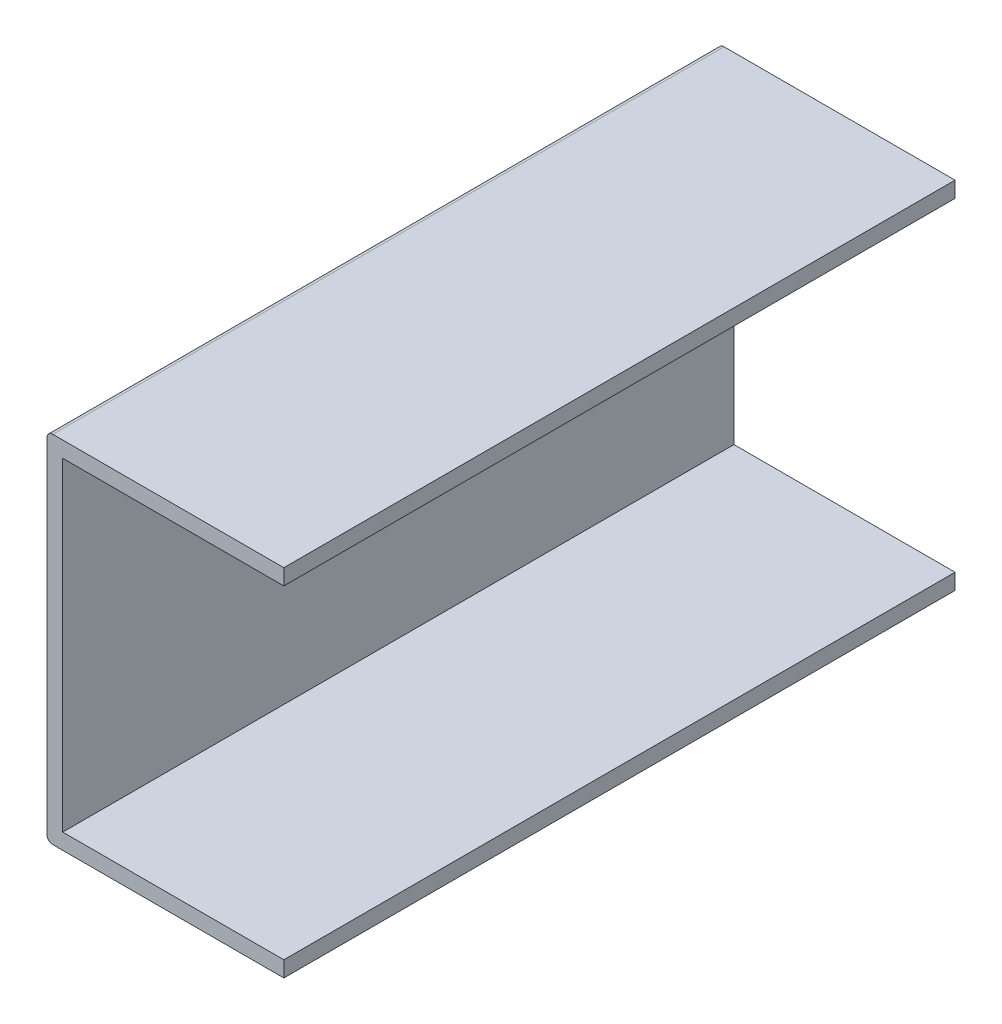
ISO-10303-21;
HEADER;
FILE_DESCRIPTION(('STEP AP214'),'2;1');
FILE_NAME('part.step','',(''),(''),'','','');
FILE_SCHEMA(('AUTOMOTIVE_DESIGN { 1 0 10303 214 1 1 1 1 }'));
ENDSEC;
DATA;
#1=APPLICATION_CONTEXT('core data for automotive mechanical design processes');
#2=APPLICATION_PROTOCOL_DEFINITION('international standard','automotive_design',2000,#1);
#3=PRODUCT_CONTEXT('',#1,'mechanical');
#4=PRODUCT('Part','Part','',(#3));
#5=PRODUCT_RELATED_PRODUCT_CATEGORY('part','',(#4));
#6=PRODUCT_DEFINITION_FORMATION('','',#4);
#7=PRODUCT_DEFINITION_CONTEXT('part definition',#1,'design');
#8=PRODUCT_DEFINITION('design','',#6,#7);
#9=PRODUCT_DEFINITION_SHAPE('','',#8);
#10=(LENGTH_UNIT() NAMED_UNIT(*) SI_UNIT(.MILLI.,.METRE.));
#11=(NAMED_UNIT(*) PLANE_ANGLE_UNIT() SI_UNIT($,.RADIAN.));
#12=(NAMED_UNIT(*) SI_UNIT($,.STERADIAN.) SOLID_ANGLE_UNIT());
#13=UNCERTAINTY_MEASURE_WITH_UNIT(LENGTH_MEASURE(1.E-05),#10,'distance_accuracy_value','');
#14=(GEOMETRIC_REPRESENTATION_CONTEXT(3) GLOBAL_UNCERTAINTY_ASSIGNED_CONTEXT((#13)) GLOBAL_UNIT_ASSIGNED_CONTEXT((#10,
#11,#12)) REPRESENTATION_CONTEXT('',''));
#15=CARTESIAN_POINT('',(0.,0.,0.));
#16=DIRECTION('',(0.,0.,1.));
#17=DIRECTION('',(1.,0.,0.));
#18=AXIS2_PLACEMENT_3D('',#15,#16,#17);
#19=CARTESIAN_POINT('',(0.15,0.,-0.85));
#20=DIRECTION('',(1.,0.,0.));
#21=DIRECTION('',(0.,1.,0.));
#22=AXIS2_PLACEMENT_3D('',#19,#20,#21);
#23=PLANE('',#22);
#24=DIRECTION('',(0.,1.,0.));
#25=VECTOR('',#24,1.);
#26=CARTESIAN_POINT('',(0.15,0.,-0.85));
#27=LINE('',#26,#25);
#28=CARTESIAN_POINT('',(0.15,-0.225,-0.85));
#29=VERTEX_POINT('',#28);
#30=CARTESIAN_POINT('',(0.15,-0.205,-0.85));
#31=VERTEX_POINT('',#30);
#32=EDGE_CURVE('E159',#29,#31,#27,.T.);
#33=ORIENTED_EDGE('',*,*,#32,.T.);
#34=DIRECTION('',(0.,0.,1.));
#35=VECTOR('',#34,1.);
#36=CARTESIAN_POINT('',(0.15,-0.205,-0.85));
#37=LINE('',#36,#35);
#38=CARTESIAN_POINT('',(0.15,-0.205,0.));
#39=VERTEX_POINT('',#38);
#40=EDGE_CURVE('E11',#31,#39,#37,.T.);
#41=ORIENTED_EDGE('',*,*,#40,.T.);
#42=DIRECTION('',(0.,1.,0.));
#43=VECTOR('',#42,1.);
#44=CARTESIAN_POINT('',(0.15,0.,0.));
#45=LINE('',#44,#43);
#46=CARTESIAN_POINT('',(0.15,-0.225,0.));
#47=VERTEX_POINT('',#46);
#48=EDGE_CURVE('E20',#47,#39,#45,.T.);
#49=ORIENTED_EDGE('',*,*,#48,.F.);
#50=DIRECTION('',(0.,0.,1.));
#51=VECTOR('',#50,1.);
#52=CARTESIAN_POINT('',(0.15,-0.225,-0.85));
#53=LINE('',#52,#51);
#54=EDGE_CURVE('E152',#29,#47,#53,.T.);
#55=ORIENTED_EDGE('',*,*,#54,.F.);
#56=EDGE_LOOP('',(#33,#41,#49,#55));
#57=FACE_BOUND('',#56,.T.);
#58=ADVANCED_FACE('F16',(#57),#23,.T.);
#59=CARTESIAN_POINT('',(0.,-0.205,-0.85));
#60=DIRECTION('',(0.,-1.,0.));
#61=DIRECTION('',(0.,0.,-1.));
#62=AXIS2_PLACEMENT_3D('',#59,#60,#61);
#63=PLANE('',#62);
#64=ORIENTED_EDGE('',*,*,#40,.F.);
#65=DIRECTION('',(-1.,0.,0.));
#66=VECTOR('',#65,1.);
#67=CARTESIAN_POINT('',(0.,-0.205,-0.85));
#68=LINE('',#67,#66);
#69=CARTESIAN_POINT('',(-0.13,-0.205,-0.85));
#70=VERTEX_POINT('',#69);
#71=EDGE_CURVE('E155',#31,#70,#68,.T.);
#72=ORIENTED_EDGE('',*,*,#71,.T.);
#73=DIRECTION('',(0.,0.,1.));
#74=VECTOR('',#73,1.);
#75=CARTESIAN_POINT('',(-0.13,-0.205,-0.85));
#76=LINE('',#75,#74);
#77=CARTESIAN_POINT('',(-0.13,-0.205,0.));
#78=VERTEX_POINT('',#77);
#79=EDGE_CURVE('E27',#70,#78,#76,.T.);
#80=ORIENTED_EDGE('',*,*,#79,.T.);
#81=DIRECTION('',(-1.,0.,0.));
#82=VECTOR('',#81,1.);
#83=CARTESIAN_POINT('',(0.,-0.205,0.));
#84=LINE('',#83,#82);
#85=EDGE_CURVE('E164',#39,#78,#84,.T.);
#86=ORIENTED_EDGE('',*,*,#85,.F.);
#87=EDGE_LOOP('',(#64,#72,#80,#86));
#88=FACE_BOUND('',#87,.T.);
#89=ADVANCED_FACE('F236',(#88),#63,.F.);
#90=CARTESIAN_POINT('',(-0.13,0.,-0.85));
#91=DIRECTION('',(-1.,0.,0.));
#92=DIRECTION('',(0.,1.,0.));
#93=AXIS2_PLACEMENT_3D('',#90,#91,#92);
#94=PLANE('',#93);
#95=ORIENTED_EDGE('',*,*,#79,.F.);
#96=DIRECTION('',(0.,1.,0.));
#97=VECTOR('',#96,1.);
#98=CARTESIAN_POINT('',(-0.13,0.,-0.85));
#99=LINE('',#98,#97);
#100=CARTESIAN_POINT('',(-0.13,0.205,-0.85));
#101=VERTEX_POINT('',#100);
#102=EDGE_CURVE('E160',#70,#101,#99,.T.);
#103=ORIENTED_EDGE('',*,*,#102,.T.);
#104=DIRECTION('',(0.,0.,-1.));
#105=VECTOR('',#104,1.);
#106=CARTESIAN_POINT('',(-0.13,0.205,-0.85));
#107=LINE('',#106,#105);
#108=CARTESIAN_POINT('',(-0.13,0.205,0.));
#109=VERTEX_POINT('',#108);
#110=EDGE_CURVE('E147',#109,#101,#107,.T.);
#111=ORIENTED_EDGE('',*,*,#110,.F.);
#112=DIRECTION('',(0.,1.,0.));
#113=VECTOR('',#112,1.);
#114=CARTESIAN_POINT('',(-0.13,0.,0.));
#115=LINE('',#114,#113);
#116=EDGE_CURVE('E168',#78,#109,#115,.T.);
#117=ORIENTED_EDGE('',*,*,#116,.F.);
#118=EDGE_LOOP('',(#95,#103,#111,#117));
#119=FACE_BOUND('',#118,.T.);
#120=ADVANCED_FACE('F416',(#119),#94,.F.);
#121=CARTESIAN_POINT('',(0.,0.205,-0.85));
#122=DIRECTION('',(0.,-1.,0.));
#123=DIRECTION('',(0.,0.,-1.));
#124=AXIS2_PLACEMENT_3D('',#121,#122,#123);
#125=PLANE('',#124);
#126=DIRECTION('',(1.,0.,0.));
#127=VECTOR('',#126,1.);
#128=CARTESIAN_POINT('',(0.,0.205,-0.85));
#129=LINE('',#128,#127);
#130=CARTESIAN_POINT('',(0.15,0.205,-0.85));
#131=VERTEX_POINT('',#130);
#132=EDGE_CURVE('E188',#101,#131,#129,.T.);
#133=ORIENTED_EDGE('',*,*,#132,.T.);
#134=DIRECTION('',(0.,0.,-1.));
#135=VECTOR('',#134,1.);
#136=CARTESIAN_POINT('',(0.15,0.205,-0.85));
#137=LINE('',#136,#135);
#138=CARTESIAN_POINT('',(0.15,0.205,0.));
#139=VERTEX_POINT('',#138);
#140=EDGE_CURVE('E41',#139,#131,#137,.T.);
#141=ORIENTED_EDGE('',*,*,#140,.F.);
#142=DIRECTION('',(1.,0.,0.));
#143=VECTOR('',#142,1.);
#144=CARTESIAN_POINT('',(0.,0.205,0.));
#145=LINE('',#144,#143);
#146=EDGE_CURVE('E198',#109,#139,#145,.T.);
#147=ORIENTED_EDGE('',*,*,#146,.F.);
#148=ORIENTED_EDGE('',*,*,#110,.T.);
#149=EDGE_LOOP('',(#133,#141,#147,#148));
#150=FACE_BOUND('',#149,.T.);
#151=ADVANCED_FACE('F407',(#150),#125,.T.);
#152=CARTESIAN_POINT('',(0.15,0.,-0.85));
#153=DIRECTION('',(1.,0.,0.));
#154=DIRECTION('',(0.,1.,0.));
#155=AXIS2_PLACEMENT_3D('',#152,#153,#154);
#156=PLANE('',#155);
#157=DIRECTION('',(0.,1.,0.));
#158=VECTOR('',#157,1.);
#159=CARTESIAN_POINT('',(0.15,0.,-0.85));
#160=LINE('',#159,#158);
#161=CARTESIAN_POINT('',(0.15,0.225,-0.85));
#162=VERTEX_POINT('',#161);
#163=EDGE_CURVE('E177',#131,#162,#160,.T.);
#164=ORIENTED_EDGE('',*,*,#163,.T.);
#165=DIRECTION('',(0.,0.,1.));
#166=VECTOR('',#165,1.);
#167=CARTESIAN_POINT('',(0.15,0.225,-0.85));
#168=LINE('',#167,#166);
#169=CARTESIAN_POINT('',(0.15,0.225,0.));
#170=VERTEX_POINT('',#169);
#171=EDGE_CURVE('E148',#162,#170,#168,.T.);
#172=ORIENTED_EDGE('',*,*,#171,.T.);
#173=DIRECTION('',(0.,1.,0.));
#174=VECTOR('',#173,1.);
#175=CARTESIAN_POINT('',(0.15,0.,0.));
#176=LINE('',#175,#174);
#177=EDGE_CURVE('E197',#139,#170,#176,.T.);
#178=ORIENTED_EDGE('',*,*,#177,.F.);
#179=ORIENTED_EDGE('',*,*,#140,.T.);
#180=EDGE_LOOP('',(#164,#172,#178,#179));
#181=FACE_BOUND('',#180,.T.);
#182=ADVANCED_FACE('F18',(#181),#156,.T.);
#183=CARTESIAN_POINT('',(0.,0.225,-0.85));
#184=DIRECTION('',(0.,-1.,0.));
#185=DIRECTION('',(0.,0.,-1.));
#186=AXIS2_PLACEMENT_3D('',#183,#184,#185);
#187=PLANE('',#186);
#188=DIRECTION('',(0.,0.,-1.));
#189=VECTOR('',#188,1.);
#190=CARTESIAN_POINT('',(-0.1425,0.225,-0.85));
#191=LINE('',#190,#189);
#192=CARTESIAN_POINT('',(-0.1425,0.225,0.));
#193=VERTEX_POINT('',#192);
#194=CARTESIAN_POINT('',(-0.1425,0.225,-0.85));
#195=VERTEX_POINT('',#194);
#196=EDGE_CURVE('E193',#193,#195,#191,.T.);
#197=ORIENTED_EDGE('',*,*,#196,.F.);
#198=DIRECTION('',(-1.,0.,0.));
#199=VECTOR('',#198,1.);
#200=CARTESIAN_POINT('',(0.,0.225,0.));
#201=LINE('',#200,#199);
#202=EDGE_CURVE('E143',#170,#193,#201,.T.);
#203=ORIENTED_EDGE('',*,*,#202,.F.);
#204=ORIENTED_EDGE('',*,*,#171,.F.);
#205=DIRECTION('',(-1.,0.,0.));
#206=VECTOR('',#205,1.);
#207=CARTESIAN_POINT('',(0.,0.225,-0.85));
#208=LINE('',#207,#206);
#209=EDGE_CURVE('E173',#162,#195,#208,.T.);
#210=ORIENTED_EDGE('',*,*,#209,.T.);
#211=EDGE_LOOP('',(#197,#203,#204,#210));
#212=FACE_BOUND('',#211,.T.);
#213=ADVANCED_FACE('F387',(#212),#187,.F.);
#214=CARTESIAN_POINT('',(0.,-0.225,-0.85));
#215=DIRECTION('',(0.,-1.,0.));
#216=DIRECTION('',(0.,0.,-1.));
#217=AXIS2_PLACEMENT_3D('',#214,#215,#216);
#218=PLANE('',#217);
#219=DIRECTION('',(1.,0.,0.));
#220=VECTOR('',#219,1.);
#221=CARTESIAN_POINT('',(0.,-0.225,-0.85));
#222=LINE('',#221,#220);
#223=CARTESIAN_POINT('',(-0.1425,-0.225,-0.85));
#224=VERTEX_POINT('',#223);
#225=EDGE_CURVE('E117',#224,#29,#222,.T.);
#226=ORIENTED_EDGE('',*,*,#225,.T.);
#227=ORIENTED_EDGE('',*,*,#54,.T.);
#228=DIRECTION('',(1.,0.,0.));
#229=VECTOR('',#228,1.);
#230=CARTESIAN_POINT('',(0.,-0.225,0.));
#231=LINE('',#230,#229);
#232=CARTESIAN_POINT('',(-0.1425,-0.225,0.));
#233=VERTEX_POINT('',#232);
#234=EDGE_CURVE('E142',#233,#47,#231,.T.);
#235=ORIENTED_EDGE('',*,*,#234,.F.);
#236=DIRECTION('',(0.,0.,1.));
#237=VECTOR('',#236,1.);
#238=CARTESIAN_POINT('',(-0.1425,-0.225,-0.85));
#239=LINE('',#238,#237);
#240=EDGE_CURVE('E113',#224,#233,#239,.T.);
#241=ORIENTED_EDGE('',*,*,#240,.F.);
#242=EDGE_LOOP('',(#226,#227,#235,#241));
#243=FACE_BOUND('',#242,.T.);
#244=ADVANCED_FACE('F376',(#243),#218,.T.);
#245=CARTESIAN_POINT('',(-0.1425,0.2175,-0.85));
#246=DIRECTION('',(0.,0.,1.));
#247=DIRECTION('',(1.,0.,0.));
#248=AXIS2_PLACEMENT_3D('',#245,#246,#247);
#249=CYLINDRICAL_SURFACE('',#248,0.0075);
#250=CARTESIAN_POINT('',(-0.1425,0.2175,0.));
#251=DIRECTION('',(0.,0.,1.));
#252=DIRECTION('',(1.,0.,0.));
#253=AXIS2_PLACEMENT_3D('',#250,#251,#252);
#254=CIRCLE('',#253,0.0075);
#255=CARTESIAN_POINT('',(-0.15,0.2175,0.));
#256=VERTEX_POINT('',#255);
#257=EDGE_CURVE('E124',#193,#256,#254,.T.);
#258=ORIENTED_EDGE('',*,*,#257,.F.);
#259=ORIENTED_EDGE('',*,*,#196,.T.);
#260=CARTESIAN_POINT('',(-0.1425,0.2175,-0.85));
#261=DIRECTION('',(0.,0.,1.));
#262=DIRECTION('',(1.,0.,0.));
#263=AXIS2_PLACEMENT_3D('',#260,#261,#262);
#264=CIRCLE('',#263,0.0075);
#265=CARTESIAN_POINT('',(-0.15,0.2175,-0.85));
#266=VERTEX_POINT('',#265);
#267=EDGE_CURVE('E178',#195,#266,#264,.T.);
#268=ORIENTED_EDGE('',*,*,#267,.T.);
#269=DIRECTION('',(0.,0.,1.));
#270=VECTOR('',#269,1.);
#271=CARTESIAN_POINT('',(-0.15,0.2175,-0.85));
#272=LINE('',#271,#270);
#273=EDGE_CURVE('E129',#266,#256,#272,.T.);
#274=ORIENTED_EDGE('',*,*,#273,.T.);
#275=EDGE_LOOP('',(#258,#259,#268,#274));
#276=FACE_BOUND('',#275,.T.);
#277=ADVANCED_FACE('F366',(#276),#249,.T.);
#278=CARTESIAN_POINT('',(0.,0.,0.));
#279=DIRECTION('',(0.,0.,1.));
#280=DIRECTION('',(1.,0.,0.));
#281=AXIS2_PLACEMENT_3D('',#278,#279,#280);
#282=PLANE('',#281);
#283=ORIENTED_EDGE('',*,*,#202,.T.);
#284=ORIENTED_EDGE('',*,*,#257,.T.);
#285=DIRECTION('',(0.,-1.,0.));
#286=VECTOR('',#285,1.);
#287=CARTESIAN_POINT('',(-0.15,0.,0.));
#288=LINE('',#287,#286);
#289=CARTESIAN_POINT('',(-0.15,-0.2175,0.));
#290=VERTEX_POINT('',#289);
#291=EDGE_CURVE('E120',#256,#290,#288,.T.);
#292=ORIENTED_EDGE('',*,*,#291,.T.);
#293=CARTESIAN_POINT('',(-0.1425,-0.2175,0.));
#294=DIRECTION('',(0.,0.,-1.));
#295=DIRECTION('',(-1.,0.,0.));
#296=AXIS2_PLACEMENT_3D('',#293,#294,#295);
#297=CIRCLE('',#296,0.0075);
#298=EDGE_CURVE('E107',#233,#290,#297,.T.);
#299=ORIENTED_EDGE('',*,*,#298,.F.);
#300=ORIENTED_EDGE('',*,*,#234,.T.);
#301=ORIENTED_EDGE('',*,*,#48,.T.);
#302=ORIENTED_EDGE('',*,*,#85,.T.);
#303=ORIENTED_EDGE('',*,*,#116,.T.);
#304=ORIENTED_EDGE('',*,*,#146,.T.);
#305=ORIENTED_EDGE('',*,*,#177,.T.);
#306=EDGE_LOOP('',(#283,#284,#292,#299,#300,#301,#302,#303,#304,#305));
#307=FACE_BOUND('',#306,.T.);
#308=ADVANCED_FACE('F122',(#307),#282,.T.);
#309=CARTESIAN_POINT('',(-0.1425,-0.2175,-0.85));
#310=DIRECTION('',(0.,0.,-1.));
#311=DIRECTION('',(-1.,0.,0.));
#312=AXIS2_PLACEMENT_3D('',#309,#310,#311);
#313=CYLINDRICAL_SURFACE('',#312,0.0075);
#314=ORIENTED_EDGE('',*,*,#298,.T.);
#315=DIRECTION('',(0.,0.,-1.));
#316=VECTOR('',#315,1.);
#317=CARTESIAN_POINT('',(-0.15,-0.2175,-0.85));
#318=LINE('',#317,#316);
#319=CARTESIAN_POINT('',(-0.15,-0.2175,-0.85));
#320=VERTEX_POINT('',#319);
#321=EDGE_CURVE('E112',#290,#320,#318,.T.);
#322=ORIENTED_EDGE('',*,*,#321,.T.);
#323=CARTESIAN_POINT('',(-0.1425,-0.2175,-0.85));
#324=DIRECTION('',(0.,0.,1.));
#325=DIRECTION('',(-1.,0.,0.));
#326=AXIS2_PLACEMENT_3D('',#323,#324,#325);
#327=CIRCLE('',#326,0.0075);
#328=EDGE_CURVE('E163',#320,#224,#327,.T.);
#329=ORIENTED_EDGE('',*,*,#328,.T.);
#330=ORIENTED_EDGE('',*,*,#240,.T.);
#331=EDGE_LOOP('',(#314,#322,#329,#330));
#332=FACE_BOUND('',#331,.T.);
#333=ADVANCED_FACE('F109',(#332),#313,.T.);
#334=CARTESIAN_POINT('',(0.,0.,-0.85));
#335=DIRECTION('',(0.,0.,1.));
#336=DIRECTION('',(1.,0.,0.));
#337=AXIS2_PLACEMENT_3D('',#334,#335,#336);
#338=PLANE('',#337);
#339=ORIENTED_EDGE('',*,*,#328,.F.);
#340=DIRECTION('',(0.,1.,0.));
#341=VECTOR('',#340,1.);
#342=CARTESIAN_POINT('',(-0.15,0.,-0.85));
#343=LINE('',#342,#341);
#344=EDGE_CURVE('E134',#320,#266,#343,.T.);
#345=ORIENTED_EDGE('',*,*,#344,.T.);
#346=ORIENTED_EDGE('',*,*,#267,.F.);
#347=ORIENTED_EDGE('',*,*,#209,.F.);
#348=ORIENTED_EDGE('',*,*,#163,.F.);
#349=ORIENTED_EDGE('',*,*,#132,.F.);
#350=ORIENTED_EDGE('',*,*,#102,.F.);
#351=ORIENTED_EDGE('',*,*,#71,.F.);
#352=ORIENTED_EDGE('',*,*,#32,.F.);
#353=ORIENTED_EDGE('',*,*,#225,.F.);
#354=EDGE_LOOP('',(#339,#345,#346,#347,#348,#349,#350,#351,#352,#353));
#355=FACE_BOUND('',#354,.T.);
#356=ADVANCED_FACE('F233',(#355),#338,.F.);
#357=CARTESIAN_POINT('',(-0.15,0.,-0.85));
#358=DIRECTION('',(1.,0.,0.));
#359=DIRECTION('',(0.,1.,0.));
#360=AXIS2_PLACEMENT_3D('',#357,#358,#359);
#361=PLANE('',#360);
#362=ORIENTED_EDGE('',*,*,#321,.F.);
#363=ORIENTED_EDGE('',*,*,#291,.F.);
#364=ORIENTED_EDGE('',*,*,#273,.F.);
#365=ORIENTED_EDGE('',*,*,#344,.F.);
#366=EDGE_LOOP('',(#362,#363,#364,#365));
#367=FACE_BOUND('',#366,.T.);
#368=ADVANCED_FACE('F132',(#367),#361,.F.);
#369=CLOSED_SHELL('',(#58,#89,#120,#151,#182,#213,#244,#277,#308,#333,#356,#368));
#370=MANIFOLD_SOLID_BREP('B1',#369);
#371=ADVANCED_BREP_SHAPE_REPRESENTATION('',(#18,#370),#14);
#372=SHAPE_DEFINITION_REPRESENTATION(#9,#371);
ENDSEC;
END-ISO-10303-21;
